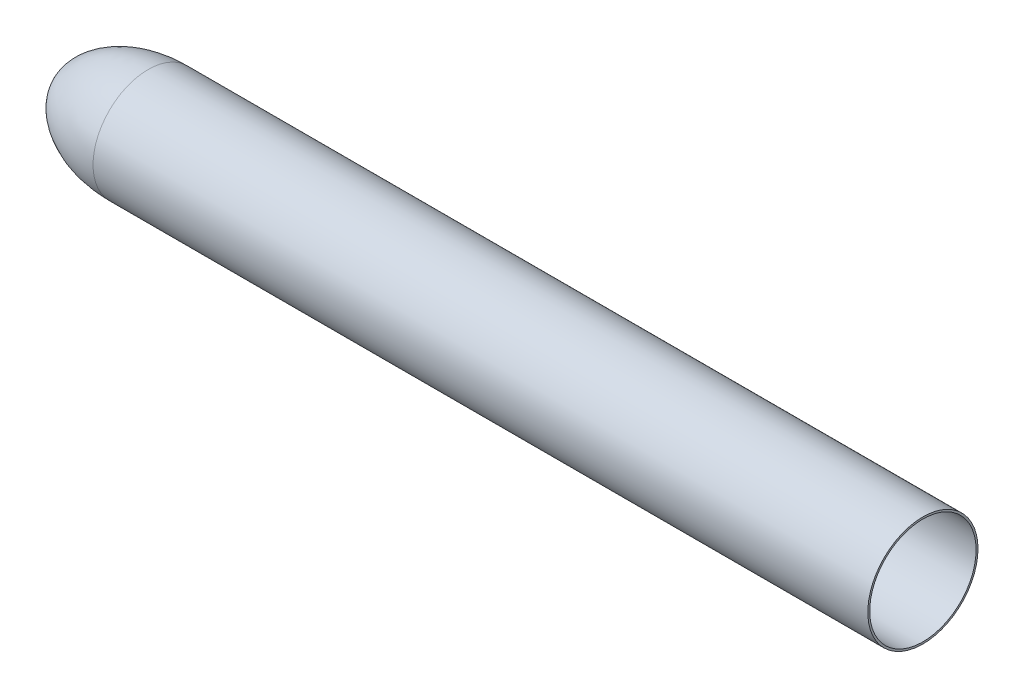
ISO-10303-21;
HEADER;
FILE_DESCRIPTION(('STEP AP214'),'2;1');
FILE_NAME('part.step','',(''),(''),'','','');
FILE_SCHEMA(('AUTOMOTIVE_DESIGN { 1 0 10303 214 1 1 1 1 }'));
ENDSEC;
DATA;
#1=APPLICATION_CONTEXT('core data for automotive mechanical design processes');
#2=APPLICATION_PROTOCOL_DEFINITION('international standard','automotive_design',2000,#1);
#3=PRODUCT_CONTEXT('',#1,'mechanical');
#4=PRODUCT('Part','Part','',(#3));
#5=PRODUCT_RELATED_PRODUCT_CATEGORY('part','',(#4));
#6=PRODUCT_DEFINITION_FORMATION('','',#4);
#7=PRODUCT_DEFINITION_CONTEXT('part definition',#1,'design');
#8=PRODUCT_DEFINITION('design','',#6,#7);
#9=PRODUCT_DEFINITION_SHAPE('','',#8);
#10=(LENGTH_UNIT() NAMED_UNIT(*) SI_UNIT(.MILLI.,.METRE.));
#11=(NAMED_UNIT(*) PLANE_ANGLE_UNIT() SI_UNIT($,.RADIAN.));
#12=(NAMED_UNIT(*) SI_UNIT($,.STERADIAN.) SOLID_ANGLE_UNIT());
#13=UNCERTAINTY_MEASURE_WITH_UNIT(LENGTH_MEASURE(1.E-05),#10,'distance_accuracy_value','');
#14=(GEOMETRIC_REPRESENTATION_CONTEXT(3) GLOBAL_UNCERTAINTY_ASSIGNED_CONTEXT((#13)) GLOBAL_UNIT_ASSIGNED_CONTEXT((#10,
#11,#12)) REPRESENTATION_CONTEXT('',''));
#15=CARTESIAN_POINT('',(0.,0.,0.));
#16=DIRECTION('',(0.,0.,1.));
#17=DIRECTION('',(1.,0.,0.));
#18=AXIS2_PLACEMENT_3D('',#15,#16,#17);
#19=CARTESIAN_POINT('',(-2350.,0.,0.));
#20=DIRECTION('',(-1.,0.,0.));
#21=DIRECTION('',(0.,0.,1.));
#22=AXIS2_PLACEMENT_3D('',#19,#20,#21);
#23=CYLINDRICAL_SURFACE('',#22,1510.);
#24=CARTESIAN_POINT('',(-2404.79274057836,0.,0.));
#25=DIRECTION('',(1.,0.,0.));
#26=DIRECTION('',(0.,0.,-1.));
#27=AXIS2_PLACEMENT_3D('',#24,#25,#26);
#28=CIRCLE('',#27,1510.);
#29=CARTESIAN_POINT('',(-2404.79274057836,-1307.6983597145,755.000000000001));
#30=VERTEX_POINT('',#29);
#31=CARTESIAN_POINT('',(-2404.79274057836,-1307.6983597145,-755.000000000002));
#32=VERTEX_POINT('',#31);
#33=EDGE_CURVE('E114',#30,#32,#28,.T.);
#34=ORIENTED_EDGE('',*,*,#33,.F.);
#35=DIRECTION('',(-1.,0.,0.));
#36=VECTOR('',#35,1.);
#37=CARTESIAN_POINT('',(-2350.,-1307.6983597145,755.000000000002));
#38=LINE('',#37,#36);
#39=CARTESIAN_POINT('',(-2370.20725942164,-1307.6983597145,755.000000000001));
#40=VERTEX_POINT('',#39);
#41=EDGE_CURVE('E154',#40,#30,#38,.T.);
#42=ORIENTED_EDGE('',*,*,#41,.F.);
#43=CARTESIAN_POINT('',(-2370.20725942164,0.,0.));
#44=DIRECTION('',(1.,0.,0.));
#45=DIRECTION('',(0.,0.,-1.));
#46=AXIS2_PLACEMENT_3D('',#43,#44,#45);
#47=CIRCLE('',#46,1510.);
#48=CARTESIAN_POINT('',(-2370.20725942164,-1307.6983597145,-755.000000000002));
#49=VERTEX_POINT('',#48);
#50=EDGE_CURVE('E131',#40,#49,#47,.T.);
#51=ORIENTED_EDGE('',*,*,#50,.T.);
#52=DIRECTION('',(-1.,0.,0.));
#53=VECTOR('',#52,1.);
#54=CARTESIAN_POINT('',(-2350.,-1307.6983597145,-755.000000000002));
#55=LINE('',#54,#53);
#56=EDGE_CURVE('E126',#49,#32,#55,.T.);
#57=ORIENTED_EDGE('',*,*,#56,.T.);
#58=EDGE_LOOP('',(#34,#42,#51,#57));
#59=FACE_BOUND('',#58,.T.);
#60=ADVANCED_FACE('F44',(#59),#23,.F.);
#61=CARTESIAN_POINT('',(-2350.,-1307.6983597145,755.000000000002));
#62=DIRECTION('',(0.,-0.5,-0.866025403784439));
#63=DIRECTION('',(0.,0.866025403784439,-0.5));
#64=AXIS2_PLACEMENT_3D('',#61,#62,#63);
#65=PLANE('',#64);
#66=DIRECTION('',(0.5,0.75,-0.43301270189222));
#67=VECTOR('',#66,1.);
#68=CARTESIAN_POINT('',(-2425.,-1338.00924884696,772.500000000002));
#69=LINE('',#68,#67);
#70=CARTESIAN_POINT('',(-2425.,-1338.00924884696,772.500000000002));
#71=VERTEX_POINT('',#70);
#72=EDGE_CURVE('E117',#71,#30,#69,.T.);
#73=ORIENTED_EDGE('',*,*,#72,.F.);
#74=DIRECTION('',(-1.,0.,0.));
#75=VECTOR('',#74,1.);
#76=CARTESIAN_POINT('',(-2350.,-1338.00924884696,772.500000000001));
#77=LINE('',#76,#75);
#78=CARTESIAN_POINT('',(-2350.,-1338.00924884696,772.500000000001));
#79=VERTEX_POINT('',#78);
#80=EDGE_CURVE('E141',#79,#71,#77,.T.);
#81=ORIENTED_EDGE('',*,*,#80,.F.);
#82=DIRECTION('',(0.500000000000001,-0.749999999999999,0.43301270189222));
#83=VECTOR('',#82,1.);
#84=CARTESIAN_POINT('',(-2350.,-1338.00924884696,772.500000000002));
#85=LINE('',#84,#83);
#86=EDGE_CURVE('E292',#40,#79,#85,.T.);
#87=ORIENTED_EDGE('',*,*,#86,.F.);
#88=ORIENTED_EDGE('',*,*,#41,.T.);
#89=EDGE_LOOP('',(#73,#81,#87,#88));
#90=FACE_BOUND('',#89,.T.);
#91=ADVANCED_FACE('F239',(#90),#65,.F.);
#92=CARTESIAN_POINT('',(-2350.,-1307.6983597145,-755.000000000002));
#93=DIRECTION('',(0.,-0.499999999999998,0.86602540378444));
#94=DIRECTION('',(0.,-0.86602540378444,-0.499999999999998));
#95=AXIS2_PLACEMENT_3D('',#92,#93,#94);
#96=PLANE('',#95);
#97=DIRECTION('',(0.5,0.75,0.43301270189222));
#98=VECTOR('',#97,1.);
#99=CARTESIAN_POINT('',(-2425.,-1338.00924884696,-772.500000000001));
#100=LINE('',#99,#98);
#101=CARTESIAN_POINT('',(-2425.,-1338.00924884696,-772.500000000002));
#102=VERTEX_POINT('',#101);
#103=EDGE_CURVE('E62',#102,#32,#100,.T.);
#104=ORIENTED_EDGE('',*,*,#103,.T.);
#105=ORIENTED_EDGE('',*,*,#56,.F.);
#106=DIRECTION('',(0.500000000000001,-0.749999999999999,-0.43301270189222));
#107=VECTOR('',#106,1.);
#108=CARTESIAN_POINT('',(-2350.,-1338.00924884696,-772.500000000002));
#109=LINE('',#108,#107);
#110=CARTESIAN_POINT('',(-2350.,-1338.00924884696,-772.500000000002));
#111=VERTEX_POINT('',#110);
#112=EDGE_CURVE('E288',#49,#111,#109,.T.);
#113=ORIENTED_EDGE('',*,*,#112,.T.);
#114=DIRECTION('',(-1.,0.,0.));
#115=VECTOR('',#114,1.);
#116=CARTESIAN_POINT('',(-2350.,-1338.00924884696,-772.500000000002));
#117=LINE('',#116,#115);
#118=EDGE_CURVE('E132',#111,#102,#117,.T.);
#119=ORIENTED_EDGE('',*,*,#118,.T.);
#120=EDGE_LOOP('',(#104,#105,#113,#119));
#121=FACE_BOUND('',#120,.T.);
#122=ADVANCED_FACE('F130',(#121),#96,.F.);
#123=CARTESIAN_POINT('',(-22500.,0.,0.));
#124=DIRECTION('',(1.,0.,0.));
#125=DIRECTION('',(0.,0.,-1.));
#126=AXIS2_PLACEMENT_3D('',#123,#124,#125);
#127=CYLINDRICAL_SURFACE('',#126,1545.);
#128=CARTESIAN_POINT('',(-2350.,0.,0.));
#129=DIRECTION('',(1.,0.,0.));
#130=DIRECTION('',(0.,0.,-1.));
#131=AXIS2_PLACEMENT_3D('',#128,#129,#130);
#132=CIRCLE('',#131,1545.);
#133=CARTESIAN_POINT('',(-2350.,1338.00924884696,-772.500000000002));
#134=VERTEX_POINT('',#133);
#135=CARTESIAN_POINT('',(-2350.,1338.00924884696,772.500000000002));
#136=VERTEX_POINT('',#135);
#137=EDGE_CURVE('E176',#134,#136,#132,.T.);
#138=ORIENTED_EDGE('',*,*,#137,.F.);
#139=DIRECTION('',(-1.,0.,0.));
#140=VECTOR('',#139,1.);
#141=CARTESIAN_POINT('',(-2350.,1338.00924884696,-772.500000000002));
#142=LINE('',#141,#140);
#143=CARTESIAN_POINT('',(-2425.,1338.00924884696,-772.500000000002));
#144=VERTEX_POINT('',#143);
#145=EDGE_CURVE('E170',#134,#144,#142,.T.);
#146=ORIENTED_EDGE('',*,*,#145,.T.);
#147=CARTESIAN_POINT('',(-2425.,0.,0.));
#148=DIRECTION('',(1.,0.,0.));
#149=DIRECTION('',(0.,0.,-1.));
#150=AXIS2_PLACEMENT_3D('',#147,#148,#149);
#151=CIRCLE('',#150,1545.);
#152=CARTESIAN_POINT('',(-2425.,1338.00924884696,772.500000000002));
#153=VERTEX_POINT('',#152);
#154=EDGE_CURVE('E185',#144,#153,#151,.T.);
#155=ORIENTED_EDGE('',*,*,#154,.T.);
#156=DIRECTION('',(-1.,0.,0.));
#157=VECTOR('',#156,1.);
#158=CARTESIAN_POINT('',(-2350.,1338.00924884696,772.500000000002));
#159=LINE('',#158,#157);
#160=EDGE_CURVE('E66',#136,#153,#159,.T.);
#161=ORIENTED_EDGE('',*,*,#160,.F.);
#162=EDGE_LOOP('',(#138,#146,#155,#161));
#163=FACE_BOUND('',#162,.T.);
#164=CARTESIAN_POINT('',(-2500.,0.,0.));
#165=DIRECTION('',(1.,0.,0.));
#166=DIRECTION('',(0.,0.,-1.));
#167=AXIS2_PLACEMENT_3D('',#164,#165,#166);
#168=CIRCLE('',#167,1545.);
#169=CARTESIAN_POINT('',(-2500.,0.,-1545.));
#170=VERTEX_POINT('',#169);
#171=EDGE_CURVE('E198',#170,#170,#168,.T.);
#172=ORIENTED_EDGE('',*,*,#171,.F.);
#173=EDGE_LOOP('',(#172));
#174=FACE_BOUND('',#173,.T.);
#175=CARTESIAN_POINT('',(0.,0.,0.));
#176=DIRECTION('',(1.,0.,0.));
#177=DIRECTION('',(0.,0.,-1.));
#178=AXIS2_PLACEMENT_3D('',#175,#176,#177);
#179=CIRCLE('',#178,1545.);
#180=CARTESIAN_POINT('',(0.,0.,-1545.));
#181=VERTEX_POINT('',#180);
#182=EDGE_CURVE('E207',#181,#181,#179,.T.);
#183=ORIENTED_EDGE('',*,*,#182,.T.);
#184=EDGE_LOOP('',(#183));
#185=FACE_BOUND('',#184,.T.);
#186=CARTESIAN_POINT('',(-2350.,0.,0.));
#187=DIRECTION('',(1.,0.,0.));
#188=DIRECTION('',(0.,0.,1.));
#189=AXIS2_PLACEMENT_3D('',#186,#187,#188);
#190=CIRCLE('',#189,1545.);
#191=EDGE_CURVE('E140',#79,#111,#190,.T.);
#192=ORIENTED_EDGE('',*,*,#191,.F.);
#193=ORIENTED_EDGE('',*,*,#80,.T.);
#194=CARTESIAN_POINT('',(-2425.,0.,0.));
#195=DIRECTION('',(1.,0.,0.));
#196=DIRECTION('',(0.,0.,1.));
#197=AXIS2_PLACEMENT_3D('',#194,#195,#196);
#198=CIRCLE('',#197,1545.);
#199=EDGE_CURVE('E147',#71,#102,#198,.T.);
#200=ORIENTED_EDGE('',*,*,#199,.T.);
#201=ORIENTED_EDGE('',*,*,#118,.F.);
#202=EDGE_LOOP('',(#192,#193,#200,#201));
#203=FACE_BOUND('',#202,.T.);
#204=ADVANCED_FACE('F229',(#163,#174,#185,#203),#127,.F.);
#205=CARTESIAN_POINT('',(-22500.,0.,0.));
#206=DIRECTION('',(1.,0.,0.));
#207=DIRECTION('',(0.,0.,-1.));
#208=AXIS2_PLACEMENT_3D('',#205,#206,#207);
#209=CYLINDRICAL_SURFACE('',#208,1600.);
#210=CARTESIAN_POINT('',(-22500.,0.,0.));
#211=DIRECTION('',(1.,0.,0.));
#212=DIRECTION('',(0.,0.,-1.));
#213=AXIS2_PLACEMENT_3D('',#210,#211,#212);
#214=CIRCLE('',#213,1600.);
#215=CARTESIAN_POINT('',(-22500.,0.,-1600.));
#216=VERTEX_POINT('',#215);
#217=EDGE_CURVE('E53',#216,#216,#214,.T.);
#218=ORIENTED_EDGE('',*,*,#217,.T.);
#219=EDGE_LOOP('',(#218));
#220=FACE_BOUND('',#219,.T.);
#221=CARTESIAN_POINT('',(0.,0.,0.));
#222=DIRECTION('',(1.,0.,0.));
#223=DIRECTION('',(0.,0.,-1.));
#224=AXIS2_PLACEMENT_3D('',#221,#222,#223);
#225=CIRCLE('',#224,1600.);
#226=CARTESIAN_POINT('',(0.,0.,-1600.));
#227=VERTEX_POINT('',#226);
#228=EDGE_CURVE('E212',#227,#227,#225,.T.);
#229=ORIENTED_EDGE('',*,*,#228,.F.);
#230=EDGE_LOOP('',(#229));
#231=FACE_BOUND('',#230,.T.);
#232=ADVANCED_FACE('F226',(#220,#231),#209,.T.);
#233=CARTESIAN_POINT('',(-22500.,0.,0.));
#234=DIRECTION('',(0.,-1.,0.));
#235=DIRECTION('',(-1.,0.,0.));
#236=AXIS2_PLACEMENT_3D('',#233,#234,#235);
#237=ELLIPSE('',#236,2500.,1600.);
#238=TRIMMED_CURVE('',#237,(PARAMETER_VALUE(0.)),(PARAMETER_VALUE(3.14159265358979)),.T.,.PARAMETER.);
#239=CARTESIAN_POINT('',(-20000.,0.,0.));
#240=DIRECTION('',(-1.,0.,0.));
#241=AXIS1_PLACEMENT('',#239,#240);
#242=SURFACE_OF_REVOLUTION('',#238,#241);
#243=CARTESIAN_POINT('',(-25000.,0.,0.));
#244=VERTEX_POINT('',#243);
#245=VERTEX_LOOP('',#244);
#246=FACE_BOUND('',#245,.T.);
#247=ORIENTED_EDGE('',*,*,#217,.F.);
#248=EDGE_LOOP('',(#247));
#249=FACE_BOUND('',#248,.T.);
#250=ADVANCED_FACE('F50',(#246,#249),#242,.F.);
#251=CARTESIAN_POINT('',(0.,0.,0.));
#252=DIRECTION('',(1.,0.,0.));
#253=DIRECTION('',(0.,0.,-1.));
#254=AXIS2_PLACEMENT_3D('',#251,#252,#253);
#255=PLANE('',#254);
#256=ORIENTED_EDGE('',*,*,#182,.F.);
#257=EDGE_LOOP('',(#256));
#258=FACE_BOUND('',#257,.T.);
#259=ORIENTED_EDGE('',*,*,#228,.T.);
#260=EDGE_LOOP('',(#259));
#261=FACE_BOUND('',#260,.T.);
#262=ADVANCED_FACE('F221',(#258,#261),#255,.T.);
#263=CARTESIAN_POINT('',(-2800.,0.,0.));
#264=DIRECTION('',(1.,0.,0.));
#265=DIRECTION('',(0.,0.,-1.));
#266=AXIS2_PLACEMENT_3D('',#263,#264,#265);
#267=PLANE('',#266);
#268=CARTESIAN_POINT('',(-2800.,0.,0.));
#269=DIRECTION('',(1.,0.,0.));
#270=DIRECTION('',(0.,0.,-1.));
#271=AXIS2_PLACEMENT_3D('',#268,#269,#270);
#272=CIRCLE('',#271,1400.);
#273=CARTESIAN_POINT('',(-2800.,0.,-1400.));
#274=VERTEX_POINT('',#273);
#275=EDGE_CURVE('E200',#274,#274,#272,.T.);
#276=ORIENTED_EDGE('',*,*,#275,.T.);
#277=EDGE_LOOP('',(#276));
#278=FACE_BOUND('',#277,.T.);
#279=CARTESIAN_POINT('',(-2800.,0.,0.));
#280=DIRECTION('',(1.,0.,0.));
#281=DIRECTION('',(0.,0.,-1.));
#282=AXIS2_PLACEMENT_3D('',#279,#280,#281);
#283=CIRCLE('',#282,1545.);
#284=CARTESIAN_POINT('',(-2800.,0.,-1545.));
#285=VERTEX_POINT('',#284);
#286=EDGE_CURVE('E11',#285,#285,#283,.F.);
#287=ORIENTED_EDGE('',*,*,#286,.T.);
#288=EDGE_LOOP('',(#287));
#289=FACE_BOUND('',#288,.T.);
#290=ADVANCED_FACE('F228',(#278,#289),#267,.F.);
#291=CARTESIAN_POINT('',(-2500.,0.,0.));
#292=DIRECTION('',(1.,0.,0.));
#293=DIRECTION('',(0.,0.,-1.));
#294=AXIS2_PLACEMENT_3D('',#291,#292,#293);
#295=PLANE('',#294);
#296=CARTESIAN_POINT('',(-2500.,0.,0.));
#297=DIRECTION('',(1.,0.,0.));
#298=DIRECTION('',(0.,0.,-1.));
#299=AXIS2_PLACEMENT_3D('',#296,#297,#298);
#300=CIRCLE('',#299,1400.);
#301=CARTESIAN_POINT('',(-2500.,0.,-1400.));
#302=VERTEX_POINT('',#301);
#303=EDGE_CURVE('E157',#302,#302,#300,.T.);
#304=ORIENTED_EDGE('',*,*,#303,.F.);
#305=EDGE_LOOP('',(#304));
#306=FACE_BOUND('',#305,.T.);
#307=ORIENTED_EDGE('',*,*,#171,.T.);
#308=EDGE_LOOP('',(#307));
#309=FACE_BOUND('',#308,.T.);
#310=ADVANCED_FACE('F272',(#306,#309),#295,.T.);
#311=CARTESIAN_POINT('',(-2800.,0.,0.));
#312=DIRECTION('',(1.,0.,0.));
#313=DIRECTION('',(0.,0.,-1.));
#314=AXIS2_PLACEMENT_3D('',#311,#312,#313);
#315=CYLINDRICAL_SURFACE('',#314,1400.);
#316=ORIENTED_EDGE('',*,*,#275,.F.);
#317=EDGE_LOOP('',(#316));
#318=FACE_BOUND('',#317,.T.);
#319=ORIENTED_EDGE('',*,*,#303,.T.);
#320=EDGE_LOOP('',(#319));
#321=FACE_BOUND('',#320,.T.);
#322=ADVANCED_FACE('F270',(#318,#321),#315,.F.);
#323=CARTESIAN_POINT('',(-22500.,0.,0.));
#324=DIRECTION('',(0.,-1.,0.));
#325=DIRECTION('',(-1.,0.,0.));
#326=AXIS2_PLACEMENT_3D('',#323,#324,#325);
#327=ELLIPSE('',#326,2500.,1600.);
#328=TRIMMED_CURVE('',#327,(PARAMETER_VALUE(0.)),(PARAMETER_VALUE(3.14159265358979)),.T.,.PARAMETER.);
#329=CARTESIAN_POINT('',(-20000.,0.,0.));
#330=DIRECTION('',(-1.,0.,0.));
#331=AXIS1_PLACEMENT('',#329,#330);
#332=SURFACE_OF_REVOLUTION('',#328,#331);
#333=OFFSET_SURFACE('',#332,55.,.F.);
#334=CARTESIAN_POINT('',(-24945.,0.,0.));
#335=VERTEX_POINT('',#334);
#336=VERTEX_LOOP('',#335);
#337=FACE_BOUND('',#336,.T.);
#338=CARTESIAN_POINT('',(-22500.,0.,0.));
#339=DIRECTION('',(1.,0.,0.));
#340=DIRECTION('',(0.,0.,-1.));
#341=AXIS2_PLACEMENT_3D('',#338,#339,#340);
#342=CIRCLE('',#341,1545.);
#343=CARTESIAN_POINT('',(-22500.,0.,-1545.));
#344=VERTEX_POINT('',#343);
#345=EDGE_CURVE('E210',#344,#344,#342,.T.);
#346=ORIENTED_EDGE('',*,*,#345,.T.);
#347=EDGE_LOOP('',(#346));
#348=FACE_BOUND('',#347,.T.);
#349=ADVANCED_FACE('F224',(#337,#348),#333,.T.);
#350=ORIENTED_EDGE('',*,*,#345,.F.);
#351=EDGE_LOOP('',(#350));
#352=FACE_BOUND('',#351,.T.);
#353=ORIENTED_EDGE('',*,*,#286,.F.);
#354=EDGE_LOOP('',(#353));
#355=FACE_BOUND('',#354,.T.);
#356=ADVANCED_FACE('F236',(#352,#355),#127,.F.);
#357=CARTESIAN_POINT('',(-2350.,1307.6983597145,755.000000000002));
#358=DIRECTION('',(0.,0.5,-0.866025403784439));
#359=DIRECTION('',(0.,0.866025403784439,0.5));
#360=AXIS2_PLACEMENT_3D('',#357,#358,#359);
#361=PLANE('',#360);
#362=DIRECTION('',(0.,-0.866025403784439,-0.5));
#363=VECTOR('',#362,1.);
#364=CARTESIAN_POINT('',(-2425.,1307.6983597145,755.000000000002));
#365=LINE('',#364,#363);
#366=CARTESIAN_POINT('',(-2425.,1307.6983597145,755.000000000002));
#367=VERTEX_POINT('',#366);
#368=EDGE_CURVE('E177',#153,#367,#365,.T.);
#369=ORIENTED_EDGE('',*,*,#368,.T.);
#370=DIRECTION('',(-1.,0.,0.));
#371=VECTOR('',#370,1.);
#372=CARTESIAN_POINT('',(-2350.,1307.6983597145,755.000000000002));
#373=LINE('',#372,#371);
#374=CARTESIAN_POINT('',(-2350.,1307.6983597145,755.000000000002));
#375=VERTEX_POINT('',#374);
#376=EDGE_CURVE('E156',#375,#367,#373,.T.);
#377=ORIENTED_EDGE('',*,*,#376,.F.);
#378=DIRECTION('',(0.,-0.866025403784439,-0.5));
#379=VECTOR('',#378,1.);
#380=CARTESIAN_POINT('',(-2350.,1307.6983597145,755.000000000002));
#381=LINE('',#380,#379);
#382=EDGE_CURVE('E192',#136,#375,#381,.T.);
#383=ORIENTED_EDGE('',*,*,#382,.F.);
#384=ORIENTED_EDGE('',*,*,#160,.T.);
#385=EDGE_LOOP('',(#369,#377,#383,#384));
#386=FACE_BOUND('',#385,.T.);
#387=ADVANCED_FACE('F247',(#386),#361,.F.);
#388=CARTESIAN_POINT('',(-2350.,0.,0.));
#389=DIRECTION('',(-1.,0.,0.));
#390=DIRECTION('',(0.,0.,1.));
#391=AXIS2_PLACEMENT_3D('',#388,#389,#390);
#392=CYLINDRICAL_SURFACE('',#391,1510.);
#393=CARTESIAN_POINT('',(-2425.,0.,0.));
#394=DIRECTION('',(-1.,0.,0.));
#395=DIRECTION('',(0.,0.,-1.));
#396=AXIS2_PLACEMENT_3D('',#393,#394,#395);
#397=CIRCLE('',#396,1510.);
#398=CARTESIAN_POINT('',(-2425.,1307.6983597145,-755.000000000002));
#399=VERTEX_POINT('',#398);
#400=EDGE_CURVE('E174',#367,#399,#397,.T.);
#401=ORIENTED_EDGE('',*,*,#400,.T.);
#402=DIRECTION('',(-1.,0.,0.));
#403=VECTOR('',#402,1.);
#404=CARTESIAN_POINT('',(-2350.,1307.6983597145,-755.000000000002));
#405=LINE('',#404,#403);
#406=CARTESIAN_POINT('',(-2350.,1307.6983597145,-755.000000000002));
#407=VERTEX_POINT('',#406);
#408=EDGE_CURVE('E161',#407,#399,#405,.T.);
#409=ORIENTED_EDGE('',*,*,#408,.F.);
#410=CARTESIAN_POINT('',(-2350.,0.,0.));
#411=DIRECTION('',(-1.,0.,0.));
#412=DIRECTION('',(0.,0.,-1.));
#413=AXIS2_PLACEMENT_3D('',#410,#411,#412);
#414=CIRCLE('',#413,1510.);
#415=EDGE_CURVE('E189',#375,#407,#414,.T.);
#416=ORIENTED_EDGE('',*,*,#415,.F.);
#417=ORIENTED_EDGE('',*,*,#376,.T.);
#418=EDGE_LOOP('',(#401,#409,#416,#417));
#419=FACE_BOUND('',#418,.T.);
#420=ADVANCED_FACE('F252',(#419),#392,.F.);
#421=CARTESIAN_POINT('',(-2350.,1307.6983597145,-755.000000000002));
#422=DIRECTION('',(0.,0.499999999999998,0.86602540378444));
#423=DIRECTION('',(0.,-0.86602540378444,0.499999999999998));
#424=AXIS2_PLACEMENT_3D('',#421,#422,#423);
#425=PLANE('',#424);
#426=DIRECTION('',(0.,0.86602540378444,-0.499999999999998));
#427=VECTOR('',#426,1.);
#428=CARTESIAN_POINT('',(-2425.,1307.6983597145,-755.000000000002));
#429=LINE('',#428,#427);
#430=EDGE_CURVE('E171',#399,#144,#429,.T.);
#431=ORIENTED_EDGE('',*,*,#430,.T.);
#432=ORIENTED_EDGE('',*,*,#145,.F.);
#433=DIRECTION('',(0.,0.86602540378444,-0.499999999999998));
#434=VECTOR('',#433,1.);
#435=CARTESIAN_POINT('',(-2350.,1307.6983597145,-755.000000000002));
#436=LINE('',#435,#434);
#437=EDGE_CURVE('E167',#407,#134,#436,.T.);
#438=ORIENTED_EDGE('',*,*,#437,.F.);
#439=ORIENTED_EDGE('',*,*,#408,.T.);
#440=EDGE_LOOP('',(#431,#432,#438,#439));
#441=FACE_BOUND('',#440,.T.);
#442=ADVANCED_FACE('F253',(#441),#425,.F.);
#443=CARTESIAN_POINT('',(-2350.,0.,0.));
#444=DIRECTION('',(1.,0.,0.));
#445=DIRECTION('',(0.,0.,-1.));
#446=AXIS2_PLACEMENT_3D('',#443,#444,#445);
#447=PLANE('',#446);
#448=ORIENTED_EDGE('',*,*,#137,.T.);
#449=ORIENTED_EDGE('',*,*,#382,.T.);
#450=ORIENTED_EDGE('',*,*,#415,.T.);
#451=ORIENTED_EDGE('',*,*,#437,.T.);
#452=EDGE_LOOP('',(#448,#449,#450,#451));
#453=FACE_BOUND('',#452,.T.);
#454=ADVANCED_FACE('F256',(#453),#447,.T.);
#455=CARTESIAN_POINT('',(-2425.,0.,0.));
#456=DIRECTION('',(1.,0.,0.));
#457=DIRECTION('',(0.,0.,-1.));
#458=AXIS2_PLACEMENT_3D('',#455,#456,#457);
#459=PLANE('',#458);
#460=ORIENTED_EDGE('',*,*,#154,.F.);
#461=ORIENTED_EDGE('',*,*,#430,.F.);
#462=ORIENTED_EDGE('',*,*,#400,.F.);
#463=ORIENTED_EDGE('',*,*,#368,.F.);
#464=EDGE_LOOP('',(#460,#461,#462,#463));
#465=FACE_BOUND('',#464,.T.);
#466=ADVANCED_FACE('F262',(#465),#459,.F.);
#467=CARTESIAN_POINT('',(-2425.,0.,0.));
#468=DIRECTION('',(-1.,0.,0.));
#469=DIRECTION('',(0.,0.,1.));
#470=AXIS2_PLACEMENT_3D('',#467,#468,#469);
#471=CONICAL_SURFACE('',#470,1545.,1.0471975511966);
#472=ORIENTED_EDGE('',*,*,#33,.T.);
#473=ORIENTED_EDGE('',*,*,#103,.F.);
#474=ORIENTED_EDGE('',*,*,#199,.F.);
#475=ORIENTED_EDGE('',*,*,#72,.T.);
#476=EDGE_LOOP('',(#472,#473,#474,#475));
#477=FACE_BOUND('',#476,.T.);
#478=ADVANCED_FACE('F116',(#477),#471,.F.);
#479=CARTESIAN_POINT('',(-2370.20725942164,0.,0.));
#480=DIRECTION('',(1.,0.,0.));
#481=DIRECTION('',(0.,0.,-1.));
#482=AXIS2_PLACEMENT_3D('',#479,#480,#481);
#483=CONICAL_SURFACE('',#482,1510.,1.0471975511966);
#484=ORIENTED_EDGE('',*,*,#50,.F.);
#485=ORIENTED_EDGE('',*,*,#86,.T.);
#486=ORIENTED_EDGE('',*,*,#191,.T.);
#487=ORIENTED_EDGE('',*,*,#112,.F.);
#488=EDGE_LOOP('',(#484,#485,#486,#487));
#489=FACE_BOUND('',#488,.T.);
#490=ADVANCED_FACE('F286',(#489),#483,.F.);
#491=CLOSED_SHELL('',(#60,#91,#122,#204,#232,#250,#262,#290,#310,#322,#349,#356,#387,#420,#442,
#454,#466,#478,#490));
#492=MANIFOLD_SOLID_BREP('B2',#491);
#493=ADVANCED_BREP_SHAPE_REPRESENTATION('',(#18,#492),#14);
#494=SHAPE_DEFINITION_REPRESENTATION(#9,#493);
ENDSEC;
END-ISO-10303-21;
